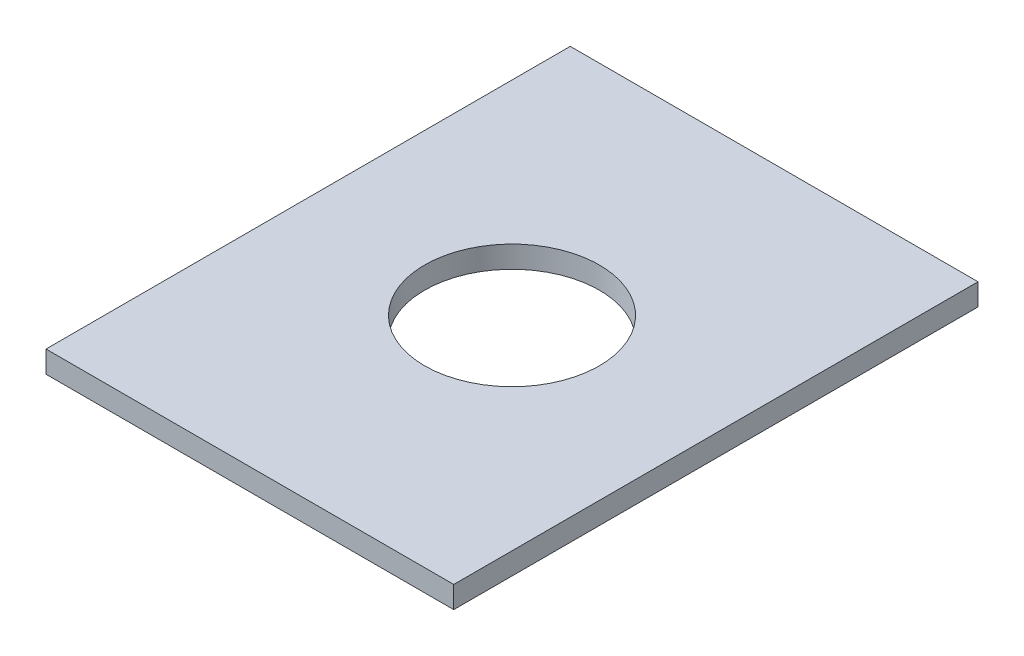
ISO-10303-21;
HEADER;
FILE_DESCRIPTION(('STEP AP214'),'2;1');
FILE_NAME('part.step','',(''),(''),'','','');
FILE_SCHEMA(('AUTOMOTIVE_DESIGN { 1 0 10303 214 1 1 1 1 }'));
ENDSEC;
DATA;
#1=APPLICATION_CONTEXT('core data for automotive mechanical design processes');
#2=APPLICATION_PROTOCOL_DEFINITION('international standard','automotive_design',2000,#1);
#3=PRODUCT_CONTEXT('',#1,'mechanical');
#4=PRODUCT('Part','Part','',(#3));
#5=PRODUCT_RELATED_PRODUCT_CATEGORY('part','',(#4));
#6=PRODUCT_DEFINITION_FORMATION('','',#4);
#7=PRODUCT_DEFINITION_CONTEXT('part definition',#1,'design');
#8=PRODUCT_DEFINITION('design','',#6,#7);
#9=PRODUCT_DEFINITION_SHAPE('','',#8);
#10=(LENGTH_UNIT() NAMED_UNIT(*) SI_UNIT(.MILLI.,.METRE.));
#11=(NAMED_UNIT(*) PLANE_ANGLE_UNIT() SI_UNIT($,.RADIAN.));
#12=(NAMED_UNIT(*) SI_UNIT($,.STERADIAN.) SOLID_ANGLE_UNIT());
#13=UNCERTAINTY_MEASURE_WITH_UNIT(LENGTH_MEASURE(1.E-05),#10,'distance_accuracy_value','');
#14=(GEOMETRIC_REPRESENTATION_CONTEXT(3) GLOBAL_UNCERTAINTY_ASSIGNED_CONTEXT((#13)) GLOBAL_UNIT_ASSIGNED_CONTEXT((#10,
#11,#12)) REPRESENTATION_CONTEXT('',''));
#15=CARTESIAN_POINT('',(0.,0.,0.));
#16=DIRECTION('',(0.,0.,1.));
#17=DIRECTION('',(1.,0.,0.));
#18=AXIS2_PLACEMENT_3D('',#15,#16,#17);
#19=CARTESIAN_POINT('',(-88.9,9.525,-114.3));
#20=DIRECTION('',(1.,0.,0.));
#21=DIRECTION('',(0.,0.,-1.));
#22=AXIS2_PLACEMENT_3D('',#19,#20,#21);
#23=PLANE('',#22);
#24=DIRECTION('',(0.,0.,1.));
#25=VECTOR('',#24,1.);
#26=CARTESIAN_POINT('',(-88.9,0.,-114.3));
#27=LINE('',#26,#25);
#28=CARTESIAN_POINT('',(-88.9,0.,-114.3));
#29=VERTEX_POINT('',#28);
#30=CARTESIAN_POINT('',(-88.8999999999999,0.,114.3));
#31=VERTEX_POINT('',#30);
#32=EDGE_CURVE('E111',#29,#31,#27,.T.);
#33=ORIENTED_EDGE('',*,*,#32,.T.);
#34=DIRECTION('',(0.,-1.,0.));
#35=VECTOR('',#34,1.);
#36=CARTESIAN_POINT('',(-88.8999999999999,9.525,114.3));
#37=LINE('',#36,#35);
#38=CARTESIAN_POINT('',(-88.8999999999999,9.525,114.3));
#39=VERTEX_POINT('',#38);
#40=EDGE_CURVE('E11',#39,#31,#37,.T.);
#41=ORIENTED_EDGE('',*,*,#40,.F.);
#42=DIRECTION('',(0.,0.,1.));
#43=VECTOR('',#42,1.);
#44=CARTESIAN_POINT('',(-88.9,9.525,-114.3));
#45=LINE('',#44,#43);
#46=CARTESIAN_POINT('',(-88.9,9.525,-114.3));
#47=VERTEX_POINT('',#46);
#48=EDGE_CURVE('E93',#47,#39,#45,.T.);
#49=ORIENTED_EDGE('',*,*,#48,.F.);
#50=DIRECTION('',(0.,-1.,0.));
#51=VECTOR('',#50,1.);
#52=CARTESIAN_POINT('',(-88.9,9.525,-114.3));
#53=LINE('',#52,#51);
#54=EDGE_CURVE('E60',#47,#29,#53,.T.);
#55=ORIENTED_EDGE('',*,*,#54,.T.);
#56=EDGE_LOOP('',(#33,#41,#49,#55));
#57=FACE_BOUND('',#56,.T.);
#58=ADVANCED_FACE('F43',(#57),#23,.F.);
#59=CARTESIAN_POINT('',(-88.8999999999999,9.525,114.3));
#60=DIRECTION('',(0.,0.,-1.));
#61=DIRECTION('',(-1.,0.,0.));
#62=AXIS2_PLACEMENT_3D('',#59,#60,#61);
#63=PLANE('',#62);
#64=DIRECTION('',(1.,0.,0.));
#65=VECTOR('',#64,1.);
#66=CARTESIAN_POINT('',(-88.8999999999999,0.,114.3));
#67=LINE('',#66,#65);
#68=CARTESIAN_POINT('',(88.9,0.,114.3));
#69=VERTEX_POINT('',#68);
#70=EDGE_CURVE('E99',#31,#69,#67,.T.);
#71=ORIENTED_EDGE('',*,*,#70,.T.);
#72=DIRECTION('',(0.,-1.,0.));
#73=VECTOR('',#72,1.);
#74=CARTESIAN_POINT('',(88.9,9.525,114.3));
#75=LINE('',#74,#73);
#76=CARTESIAN_POINT('',(88.9,9.525,114.3));
#77=VERTEX_POINT('',#76);
#78=EDGE_CURVE('E52',#77,#69,#75,.T.);
#79=ORIENTED_EDGE('',*,*,#78,.F.);
#80=DIRECTION('',(1.,0.,0.));
#81=VECTOR('',#80,1.);
#82=CARTESIAN_POINT('',(-88.8999999999999,9.525,114.3));
#83=LINE('',#82,#81);
#84=EDGE_CURVE('E85',#39,#77,#83,.T.);
#85=ORIENTED_EDGE('',*,*,#84,.F.);
#86=ORIENTED_EDGE('',*,*,#40,.T.);
#87=EDGE_LOOP('',(#71,#79,#85,#86));
#88=FACE_BOUND('',#87,.T.);
#89=ADVANCED_FACE('F98',(#88),#63,.F.);
#90=CARTESIAN_POINT('',(88.9,9.525,-114.3));
#91=DIRECTION('',(1.,0.,0.));
#92=DIRECTION('',(0.,0.,-1.));
#93=AXIS2_PLACEMENT_3D('',#90,#91,#92);
#94=PLANE('',#93);
#95=DIRECTION('',(0.,0.,1.));
#96=VECTOR('',#95,1.);
#97=CARTESIAN_POINT('',(88.9,0.,-114.3));
#98=LINE('',#97,#96);
#99=CARTESIAN_POINT('',(88.9,0.,-114.3));
#100=VERTEX_POINT('',#99);
#101=EDGE_CURVE('E117',#100,#69,#98,.T.);
#102=ORIENTED_EDGE('',*,*,#101,.F.);
#103=DIRECTION('',(0.,-1.,0.));
#104=VECTOR('',#103,1.);
#105=CARTESIAN_POINT('',(88.9,9.525,-114.3));
#106=LINE('',#105,#104);
#107=CARTESIAN_POINT('',(88.9,9.525,-114.3));
#108=VERTEX_POINT('',#107);
#109=EDGE_CURVE('E74',#108,#100,#106,.T.);
#110=ORIENTED_EDGE('',*,*,#109,.F.);
#111=DIRECTION('',(0.,0.,1.));
#112=VECTOR('',#111,1.);
#113=CARTESIAN_POINT('',(88.9,9.525,-114.3));
#114=LINE('',#113,#112);
#115=EDGE_CURVE('E92',#108,#77,#114,.T.);
#116=ORIENTED_EDGE('',*,*,#115,.T.);
#117=ORIENTED_EDGE('',*,*,#78,.T.);
#118=EDGE_LOOP('',(#102,#110,#116,#117));
#119=FACE_BOUND('',#118,.T.);
#120=ADVANCED_FACE('F103',(#119),#94,.T.);
#121=CARTESIAN_POINT('',(-88.9,9.525,-114.3));
#122=DIRECTION('',(0.,0.,-1.));
#123=DIRECTION('',(-1.,0.,0.));
#124=AXIS2_PLACEMENT_3D('',#121,#122,#123);
#125=PLANE('',#124);
#126=DIRECTION('',(1.,0.,0.));
#127=VECTOR('',#126,1.);
#128=CARTESIAN_POINT('',(-88.9,0.,-114.3));
#129=LINE('',#128,#127);
#130=EDGE_CURVE('E120',#29,#100,#129,.T.);
#131=ORIENTED_EDGE('',*,*,#130,.F.);
#132=ORIENTED_EDGE('',*,*,#54,.F.);
#133=DIRECTION('',(1.,0.,0.));
#134=VECTOR('',#133,1.);
#135=CARTESIAN_POINT('',(-88.9,9.525,-114.3));
#136=LINE('',#135,#134);
#137=EDGE_CURVE('E105',#47,#108,#136,.T.);
#138=ORIENTED_EDGE('',*,*,#137,.T.);
#139=ORIENTED_EDGE('',*,*,#109,.T.);
#140=EDGE_LOOP('',(#131,#132,#138,#139));
#141=FACE_BOUND('',#140,.T.);
#142=ADVANCED_FACE('F147',(#141),#125,.T.);
#143=CARTESIAN_POINT('',(0.,9.525,0.));
#144=DIRECTION('',(0.,1.,0.));
#145=DIRECTION('',(0.,0.,1.));
#146=AXIS2_PLACEMENT_3D('',#143,#144,#145);
#147=PLANE('',#146);
#148=CARTESIAN_POINT('',(0.,9.525,0.));
#149=DIRECTION('',(0.,1.,0.));
#150=DIRECTION('',(0.,0.,1.));
#151=AXIS2_PLACEMENT_3D('',#148,#149,#150);
#152=CIRCLE('',#151,38.1);
#153=CARTESIAN_POINT('',(0.,9.525,38.1));
#154=VERTEX_POINT('',#153);
#155=EDGE_CURVE('E130',#154,#154,#152,.T.);
#156=ORIENTED_EDGE('',*,*,#155,.F.);
#157=EDGE_LOOP('',(#156));
#158=FACE_BOUND('',#157,.T.);
#159=ORIENTED_EDGE('',*,*,#48,.T.);
#160=ORIENTED_EDGE('',*,*,#84,.T.);
#161=ORIENTED_EDGE('',*,*,#115,.F.);
#162=ORIENTED_EDGE('',*,*,#137,.F.);
#163=EDGE_LOOP('',(#159,#160,#161,#162));
#164=FACE_BOUND('',#163,.T.);
#165=ADVANCED_FACE('F89',(#158,#164),#147,.T.);
#166=CARTESIAN_POINT('',(0.,0.,0.));
#167=DIRECTION('',(0.,1.,0.));
#168=DIRECTION('',(0.,0.,1.));
#169=AXIS2_PLACEMENT_3D('',#166,#167,#168);
#170=PLANE('',#169);
#171=CARTESIAN_POINT('',(0.,0.,0.));
#172=DIRECTION('',(0.,1.,0.));
#173=DIRECTION('',(0.,0.,1.));
#174=AXIS2_PLACEMENT_3D('',#171,#172,#173);
#175=CIRCLE('',#174,38.1);
#176=CARTESIAN_POINT('',(0.,0.,38.1));
#177=VERTEX_POINT('',#176);
#178=EDGE_CURVE('E114',#177,#177,#175,.T.);
#179=ORIENTED_EDGE('',*,*,#178,.T.);
#180=EDGE_LOOP('',(#179));
#181=FACE_BOUND('',#180,.T.);
#182=ORIENTED_EDGE('',*,*,#32,.F.);
#183=ORIENTED_EDGE('',*,*,#130,.T.);
#184=ORIENTED_EDGE('',*,*,#101,.T.);
#185=ORIENTED_EDGE('',*,*,#70,.F.);
#186=EDGE_LOOP('',(#182,#183,#184,#185));
#187=FACE_BOUND('',#186,.T.);
#188=ADVANCED_FACE('F138',(#181,#187),#170,.F.);
#189=CARTESIAN_POINT('',(0.,0.,0.));
#190=DIRECTION('',(0.,1.,0.));
#191=DIRECTION('',(0.,0.,1.));
#192=AXIS2_PLACEMENT_3D('',#189,#190,#191);
#193=CYLINDRICAL_SURFACE('',#192,38.1);
#194=CARTESIAN_POINT('',(0.,0.,38.1));
#195=CARTESIAN_POINT('',(0.,0.0992187499999999,38.1));
#196=CARTESIAN_POINT('',(0.,0.1984375,38.1));
#197=CARTESIAN_POINT('',(0.,0.396875,38.1));
#198=CARTESIAN_POINT('',(0.,0.49609375,38.1));
#199=CARTESIAN_POINT('',(0.,0.69453125,38.1));
#200=CARTESIAN_POINT('',(0.,0.79375,38.1));
#201=CARTESIAN_POINT('',(0.,0.9921875,38.1));
#202=CARTESIAN_POINT('',(0.,1.09140625,38.1));
#203=CARTESIAN_POINT('',(0.,1.28984375,38.1));
#204=CARTESIAN_POINT('',(0.,1.3890625,38.1));
#205=CARTESIAN_POINT('',(0.,1.5875,38.1));
#206=CARTESIAN_POINT('',(0.,1.68671875,38.1));
#207=CARTESIAN_POINT('',(0.,1.88515625,38.1));
#208=CARTESIAN_POINT('',(0.,1.984375,38.1));
#209=CARTESIAN_POINT('',(0.,2.1828125,38.1));
#210=CARTESIAN_POINT('',(0.,2.28203125,38.1));
#211=CARTESIAN_POINT('',(0.,2.48046875,38.1));
#212=CARTESIAN_POINT('',(0.,2.5796875,38.1));
#213=CARTESIAN_POINT('',(0.,2.778125,38.1));
#214=CARTESIAN_POINT('',(0.,2.87734375,38.1));
#215=CARTESIAN_POINT('',(0.,3.07578125,38.1));
#216=CARTESIAN_POINT('',(0.,3.175,38.1));
#217=CARTESIAN_POINT('',(0.,3.3734375,38.1));
#218=CARTESIAN_POINT('',(0.,3.47265625,38.1));
#219=CARTESIAN_POINT('',(0.,3.67109375,38.1));
#220=CARTESIAN_POINT('',(0.,3.7703125,38.1));
#221=CARTESIAN_POINT('',(0.,3.96875,38.1));
#222=CARTESIAN_POINT('',(0.,4.06796875,38.1));
#223=CARTESIAN_POINT('',(0.,4.26640625,38.1));
#224=CARTESIAN_POINT('',(0.,4.365625,38.1));
#225=CARTESIAN_POINT('',(0.,4.5640625,38.1));
#226=CARTESIAN_POINT('',(0.,4.66328125,38.1));
#227=CARTESIAN_POINT('',(0.,4.86171875,38.1));
#228=CARTESIAN_POINT('',(0.,4.9609375,38.1));
#229=CARTESIAN_POINT('',(0.,5.159375,38.1));
#230=CARTESIAN_POINT('',(0.,5.25859375,38.1));
#231=CARTESIAN_POINT('',(0.,5.45703125,38.1));
#232=CARTESIAN_POINT('',(0.,5.55625,38.1));
#233=CARTESIAN_POINT('',(0.,5.7546875,38.1));
#234=CARTESIAN_POINT('',(0.,5.85390625,38.1));
#235=CARTESIAN_POINT('',(0.,6.05234375,38.1));
#236=CARTESIAN_POINT('',(0.,6.1515625,38.1));
#237=CARTESIAN_POINT('',(0.,6.35,38.1));
#238=CARTESIAN_POINT('',(0.,6.44921875,38.1));
#239=CARTESIAN_POINT('',(0.,6.64765625,38.1));
#240=CARTESIAN_POINT('',(0.,6.746875,38.1));
#241=CARTESIAN_POINT('',(0.,6.9453125,38.1));
#242=CARTESIAN_POINT('',(0.,7.04453125,38.1));
#243=CARTESIAN_POINT('',(0.,7.24296875,38.1));
#244=CARTESIAN_POINT('',(0.,7.3421875,38.1));
#245=CARTESIAN_POINT('',(0.,7.540625,38.1));
#246=CARTESIAN_POINT('',(0.,7.63984375,38.1));
#247=CARTESIAN_POINT('',(0.,7.83828125,38.1));
#248=CARTESIAN_POINT('',(0.,7.9375,38.1));
#249=CARTESIAN_POINT('',(0.,8.1359375,38.1));
#250=CARTESIAN_POINT('',(0.,8.23515625,38.1));
#251=CARTESIAN_POINT('',(0.,8.43359375,38.1));
#252=CARTESIAN_POINT('',(0.,8.5328125,38.1));
#253=CARTESIAN_POINT('',(0.,8.73125,38.1));
#254=CARTESIAN_POINT('',(0.,8.83046875,38.1));
#255=CARTESIAN_POINT('',(0.,9.02890625,38.1));
#256=CARTESIAN_POINT('',(0.,9.128125,38.1));
#257=CARTESIAN_POINT('',(0.,9.3265625,38.1));
#258=CARTESIAN_POINT('',(0.,9.42578125,38.1));
#259=CARTESIAN_POINT('',(0.,9.525,38.1));
#260=B_SPLINE_CURVE_WITH_KNOTS('',3,(#194,#195,#196,#197,#198,#199,#200,#201,#202,#203,#204,
#205,#206,#207,#208,#209,#210,#211,#212,#213,#214,#215,#216,#217,#218,#219,#220,#221,#222,#223,
#224,#225,#226,#227,#228,#229,#230,#231,#232,#233,#234,#235,#236,#237,#238,#239,#240,#241,#242,
#243,#244,#245,#246,#247,#248,#249,#250,#251,#252,#253,#254,#255,#256,#257,#258,#259),
.UNSPECIFIED.,.F.,.F.,(4,2,2,2,2,2,2,2,2,2,2,2,2,2,2,2,2,2,2,2,2,2,2,2,2,2,2,2,2,2,2,2,4),(0.,
0.29765625,0.5953125,0.89296875,1.190625,1.48828125,1.7859375,2.08359375,2.38125,2.67890625,
2.9765625,3.27421875,3.571875,3.86953125,4.1671875,4.46484375,4.7625,5.06015625,5.3578125,
5.65546875,5.953125,6.25078125,6.5484375,6.84609375,7.14375,7.44140625,7.7390625,8.03671875,
8.334375,8.63203125,8.9296875,9.22734375,9.525),.UNSPECIFIED.);
#261=EDGE_CURVE('BSEAM140',#177,#154,#260,.T.);
#262=ORIENTED_EDGE('',*,*,#178,.F.);
#263=ORIENTED_EDGE('',*,*,#155,.T.);
#264=ORIENTED_EDGE('',*,*,#261,.T.);
#265=ORIENTED_EDGE('',*,*,#261,.F.);
#266=EDGE_LOOP('',(#262,#264,#263,#265));
#267=FACE_BOUND('',#266,.T.);
#268=ADVANCED_FACE('F140',(#267),#193,.F.);
#269=CLOSED_SHELL('',(#58,#89,#120,#142,#165,#188,#268));
#270=MANIFOLD_SOLID_BREP('B2',#269);
#271=ADVANCED_BREP_SHAPE_REPRESENTATION('',(#18,#270),#14);
#272=SHAPE_DEFINITION_REPRESENTATION(#9,#271);
ENDSEC;
END-ISO-10303-21;
